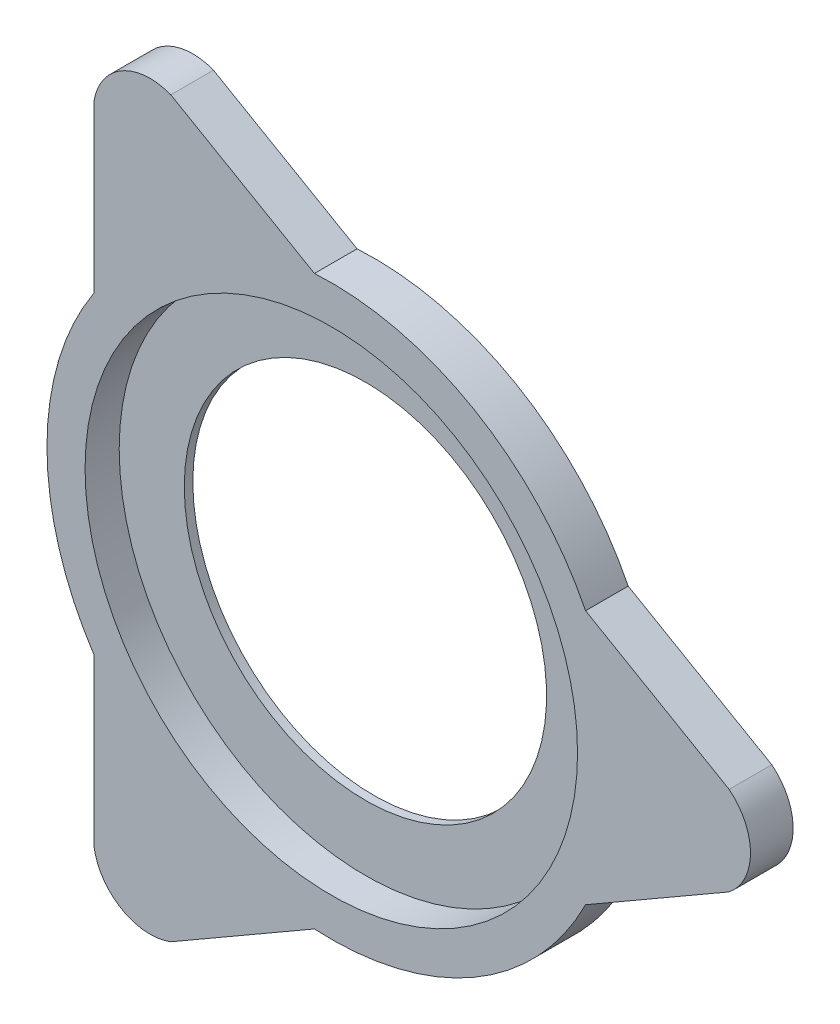
ISO-10303-21;
HEADER;
FILE_DESCRIPTION(('STEP AP214'),'2;1');
FILE_NAME('part.step','',(''),(''),'','','');
FILE_SCHEMA(('AUTOMOTIVE_DESIGN { 1 0 10303 214 1 1 1 1 }'));
ENDSEC;
DATA;
#1=APPLICATION_CONTEXT('core data for automotive mechanical design processes');
#2=APPLICATION_PROTOCOL_DEFINITION('international standard','automotive_design',2000,#1);
#3=PRODUCT_CONTEXT('',#1,'mechanical');
#4=PRODUCT('Part','Part','',(#3));
#5=PRODUCT_RELATED_PRODUCT_CATEGORY('part','',(#4));
#6=PRODUCT_DEFINITION_FORMATION('','',#4);
#7=PRODUCT_DEFINITION_CONTEXT('part definition',#1,'design');
#8=PRODUCT_DEFINITION('design','',#6,#7);
#9=PRODUCT_DEFINITION_SHAPE('','',#8);
#10=(LENGTH_UNIT() NAMED_UNIT(*) SI_UNIT(.MILLI.,.METRE.));
#11=(NAMED_UNIT(*) PLANE_ANGLE_UNIT() SI_UNIT($,.RADIAN.));
#12=(NAMED_UNIT(*) SI_UNIT($,.STERADIAN.) SOLID_ANGLE_UNIT());
#13=UNCERTAINTY_MEASURE_WITH_UNIT(LENGTH_MEASURE(1.E-05),#10,'distance_accuracy_value','');
#14=(GEOMETRIC_REPRESENTATION_CONTEXT(3) GLOBAL_UNCERTAINTY_ASSIGNED_CONTEXT((#13)) GLOBAL_UNIT_ASSIGNED_CONTEXT((#10,
#11,#12)) REPRESENTATION_CONTEXT('',''));
#15=CARTESIAN_POINT('',(0.,0.,0.));
#16=DIRECTION('',(0.,0.,1.));
#17=DIRECTION('',(1.,0.,0.));
#18=AXIS2_PLACEMENT_3D('',#15,#16,#17);
#19=CARTESIAN_POINT('',(0.,0.,9.525));
#20=DIRECTION('',(0.,0.,-1.));
#21=DIRECTION('',(-1.,0.,0.));
#22=AXIS2_PLACEMENT_3D('',#19,#20,#21);
#23=CYLINDRICAL_SURFACE('',#22,40.4563947467404);
#24=CARTESIAN_POINT('',(0.,0.,0.));
#25=DIRECTION('',(0.,0.,1.));
#26=DIRECTION('',(1.,0.,0.));
#27=AXIS2_PLACEMENT_3D('',#24,#25,#26);
#28=CIRCLE('',#27,40.4563947467404);
#29=CARTESIAN_POINT('',(-40.4563947467404,0.,0.));
#30=VERTEX_POINT('',#29);
#31=EDGE_CURVE('E163',#30,#30,#28,.T.);
#32=CARTESIAN_POINT('',(0.,0.,1.905));
#33=DIRECTION('',(0.,0.,1.));
#34=DIRECTION('',(1.,0.,0.));
#35=AXIS2_PLACEMENT_3D('',#32,#33,#34);
#36=CIRCLE('',#35,40.4563947467404);
#37=CARTESIAN_POINT('',(-40.4563947467404,0.,1.905));
#38=VERTEX_POINT('',#37);
#39=EDGE_CURVE('E41',#38,#38,#36,.T.);
#40=CARTESIAN_POINT('',(-40.4563947467404,0.,0.));
#41=CARTESIAN_POINT('',(-40.4563947467404,0.,0.0198437499999999));
#42=CARTESIAN_POINT('',(-40.4563947467404,0.,0.0396874999999998));
#43=CARTESIAN_POINT('',(-40.4563947467404,0.,0.0793749999999996));
#44=CARTESIAN_POINT('',(-40.4563947467404,0.,0.0992187499999995));
#45=CARTESIAN_POINT('',(-40.4563947467404,0.,0.13890625));
#46=CARTESIAN_POINT('',(-40.4563947467404,0.,0.15875));
#47=CARTESIAN_POINT('',(-40.4563947467404,0.,0.198437500000001));
#48=CARTESIAN_POINT('',(-40.4563947467404,0.,0.218281250000001));
#49=CARTESIAN_POINT('',(-40.4563947467404,0.,0.25796875));
#50=CARTESIAN_POINT('',(-40.4563947467404,0.,0.2778125));
#51=CARTESIAN_POINT('',(-40.4563947467404,0.,0.3175));
#52=CARTESIAN_POINT('',(-40.4563947467404,0.,0.33734375));
#53=CARTESIAN_POINT('',(-40.4563947467404,0.,0.37703125));
#54=CARTESIAN_POINT('',(-40.4563947467404,0.,0.396875000000001));
#55=CARTESIAN_POINT('',(-40.4563947467404,0.,0.436562500000001));
#56=CARTESIAN_POINT('',(-40.4563947467404,0.,0.456406250000001));
#57=CARTESIAN_POINT('',(-40.4563947467404,0.,0.496093750000001));
#58=CARTESIAN_POINT('',(-40.4563947467404,0.,0.515937500000001));
#59=CARTESIAN_POINT('',(-40.4563947467404,0.,0.555625000000001));
#60=CARTESIAN_POINT('',(-40.4563947467404,0.,0.57546875));
#61=CARTESIAN_POINT('',(-40.4563947467404,0.,0.61515625));
#62=CARTESIAN_POINT('',(-40.4563947467404,0.,0.635));
#63=CARTESIAN_POINT('',(-40.4563947467404,0.,0.6746875));
#64=CARTESIAN_POINT('',(-40.4563947467404,0.,0.694531250000001));
#65=CARTESIAN_POINT('',(-40.4563947467404,0.,0.734218750000001));
#66=CARTESIAN_POINT('',(-40.4563947467404,0.,0.754062500000001));
#67=CARTESIAN_POINT('',(-40.4563947467404,0.,0.793750000000001));
#68=CARTESIAN_POINT('',(-40.4563947467404,0.,0.813593750000001));
#69=CARTESIAN_POINT('',(-40.4563947467404,0.,0.853281250000001));
#70=CARTESIAN_POINT('',(-40.4563947467404,0.,0.873125000000001));
#71=CARTESIAN_POINT('',(-40.4563947467404,0.,0.912812500000001));
#72=CARTESIAN_POINT('',(-40.4563947467404,0.,0.932656250000002));
#73=CARTESIAN_POINT('',(-40.4563947467404,0.,0.972343750000002));
#74=CARTESIAN_POINT('',(-40.4563947467404,0.,0.992187500000002));
#75=CARTESIAN_POINT('',(-40.4563947467404,0.,1.031875));
#76=CARTESIAN_POINT('',(-40.4563947467404,0.,1.05171875));
#77=CARTESIAN_POINT('',(-40.4563947467404,0.,1.09140625));
#78=CARTESIAN_POINT('',(-40.4563947467404,0.,1.11125));
#79=CARTESIAN_POINT('',(-40.4563947467404,0.,1.1509375));
#80=CARTESIAN_POINT('',(-40.4563947467404,0.,1.17078125));
#81=CARTESIAN_POINT('',(-40.4563947467404,0.,1.21046875));
#82=CARTESIAN_POINT('',(-40.4563947467404,0.,1.2303125));
#83=CARTESIAN_POINT('',(-40.4563947467404,0.,1.27));
#84=CARTESIAN_POINT('',(-40.4563947467404,0.,1.28984375));
#85=CARTESIAN_POINT('',(-40.4563947467404,0.,1.32953125));
#86=CARTESIAN_POINT('',(-40.4563947467404,0.,1.349375));
#87=CARTESIAN_POINT('',(-40.4563947467404,0.,1.3890625));
#88=CARTESIAN_POINT('',(-40.4563947467404,0.,1.40890625));
#89=CARTESIAN_POINT('',(-40.4563947467404,0.,1.44859375));
#90=CARTESIAN_POINT('',(-40.4563947467404,0.,1.4684375));
#91=CARTESIAN_POINT('',(-40.4563947467404,0.,1.508125));
#92=CARTESIAN_POINT('',(-40.4563947467404,0.,1.52796875));
#93=CARTESIAN_POINT('',(-40.4563947467404,0.,1.56765625));
#94=CARTESIAN_POINT('',(-40.4563947467404,0.,1.5875));
#95=CARTESIAN_POINT('',(-40.4563947467404,0.,1.6271875));
#96=CARTESIAN_POINT('',(-40.4563947467404,0.,1.64703125));
#97=CARTESIAN_POINT('',(-40.4563947467404,0.,1.68671875));
#98=CARTESIAN_POINT('',(-40.4563947467404,0.,1.7065625));
#99=CARTESIAN_POINT('',(-40.4563947467404,0.,1.74625));
#100=CARTESIAN_POINT('',(-40.4563947467404,0.,1.76609375));
#101=CARTESIAN_POINT('',(-40.4563947467404,0.,1.80578125));
#102=CARTESIAN_POINT('',(-40.4563947467404,0.,1.825625));
#103=CARTESIAN_POINT('',(-40.4563947467404,0.,1.8653125));
#104=CARTESIAN_POINT('',(-40.4563947467404,0.,1.88515625));
#105=CARTESIAN_POINT('',(-40.4563947467404,0.,1.905));
#106=B_SPLINE_CURVE_WITH_KNOTS('',3,(#40,#41,#42,#43,#44,#45,#46,#47,#48,#49,#50,#51,#52,#53,
#54,#55,#56,#57,#58,#59,#60,#61,#62,#63,#64,#65,#66,#67,#68,#69,#70,#71,#72,#73,#74,#75,#76,#77,
#78,#79,#80,#81,#82,#83,#84,#85,#86,#87,#88,#89,#90,#91,#92,#93,#94,#95,#96,#97,#98,#99,#100,
#101,#102,#103,#104,#105),.UNSPECIFIED.,.F.,.F.,(4,2,2,2,2,2,2,2,2,2,2,2,2,2,2,2,2,2,2,2,2,2,2,
2,2,2,2,2,2,2,2,2,4),(0.,0.0595312499999997,0.119062499999999,0.178593750000001,0.238125,
0.29765625,0.3571875,0.416718750000001,0.476250000000001,0.535781250000001,0.5953125,0.65484375,
0.714375000000001,0.773906250000001,0.833437500000001,0.892968750000001,0.952500000000002,
1.01203125,1.0715625,1.13109375,1.190625,1.25015625,1.3096875,1.36921875,1.42875,1.48828125,
1.5478125,1.60734375,1.666875,1.72640625,1.7859375,1.84546875,1.905),.UNSPECIFIED.);
#107=EDGE_CURVE('BSEAM37',#30,#38,#106,.T.);
#108=ORIENTED_EDGE('',*,*,#31,.F.);
#109=ORIENTED_EDGE('',*,*,#39,.T.);
#110=ORIENTED_EDGE('',*,*,#107,.T.);
#111=ORIENTED_EDGE('',*,*,#107,.F.);
#112=EDGE_LOOP('',(#108,#110,#109,#111));
#113=FACE_BOUND('',#112,.T.);
#114=ADVANCED_FACE('F37',(#113),#23,.F.);
#115=CARTESIAN_POINT('',(0.,0.,9.525));
#116=DIRECTION('',(0.,0.,1.));
#117=DIRECTION('',(1.,0.,0.));
#118=AXIS2_PLACEMENT_3D('',#115,#116,#117);
#119=PLANE('',#118);
#120=CARTESIAN_POINT('',(0.,0.,9.525));
#121=DIRECTION('',(0.,0.,1.));
#122=DIRECTION('',(1.,0.,0.));
#123=AXIS2_PLACEMENT_3D('',#120,#121,#122);
#124=CIRCLE('',#123,54.9919447217432);
#125=CARTESIAN_POINT('',(54.9919447217432,0.,9.525));
#126=VERTEX_POINT('',#125);
#127=EDGE_CURVE('E359',#126,#126,#124,.T.);
#128=ORIENTED_EDGE('',*,*,#127,.F.);
#129=EDGE_LOOP('',(#128));
#130=FACE_BOUND('',#129,.T.);
#131=CARTESIAN_POINT('',(0.,0.,9.525));
#132=DIRECTION('',(0.,0.,1.));
#133=DIRECTION('',(1.,0.,0.));
#134=AXIS2_PLACEMENT_3D('',#131,#132,#133);
#135=CIRCLE('',#134,63.5);
#136=CARTESIAN_POINT('',(56.7796058709401,28.4310808296257,9.525));
#137=VERTEX_POINT('',#136);
#138=CARTESIAN_POINT('',(-3.76776467996547,63.388121515915,9.525));
#139=VERTEX_POINT('',#138);
#140=EDGE_CURVE('E182',#137,#139,#135,.T.);
#141=ORIENTED_EDGE('',*,*,#140,.T.);
#142=DIRECTION('',(-0.866025403784439,0.5,0.));
#143=VECTOR('',#142,1.);
#144=CARTESIAN_POINT('',(-3.76776467996547,63.388121515915,9.525));
#145=LINE('',#144,#143);
#146=CARTESIAN_POINT('',(-35.8333840191295,81.9012154731134,9.525));
#147=VERTEX_POINT('',#146);
#148=EDGE_CURVE('E110',#139,#147,#145,.T.);
#149=ORIENTED_EDGE('',*,*,#148,.T.);
#150=CARTESIAN_POINT('',(-40.4563947467404,70.072531192417,9.525));
#151=DIRECTION('',(0.,0.,1.));
#152=DIRECTION('',(-1.,0.,0.));
#153=AXIS2_PLACEMENT_3D('',#150,#151,#152);
#154=CIRCLE('',#153,12.7);
#155=CARTESIAN_POINT('',(-53.0118411909746,71.983228600686,9.525));
#156=VERTEX_POINT('',#155);
#157=EDGE_CURVE('E210',#147,#156,#154,.T.);
#158=ORIENTED_EDGE('',*,*,#157,.T.);
#159=DIRECTION('',(0.,-1.,0.));
#160=VECTOR('',#159,1.);
#161=CARTESIAN_POINT('',(-53.0118411909746,71.983228600686,9.525));
#162=LINE('',#161,#160);
#163=CARTESIAN_POINT('',(-53.0118411909746,34.9570406862893,9.525));
#164=VERTEX_POINT('',#163);
#165=EDGE_CURVE('E229',#156,#164,#162,.T.);
#166=ORIENTED_EDGE('',*,*,#165,.T.);
#167=CARTESIAN_POINT('',(0.,0.,9.525));
#168=DIRECTION('',(0.,0.,1.));
#169=DIRECTION('',(1.,0.,0.));
#170=AXIS2_PLACEMENT_3D('',#167,#168,#169);
#171=CIRCLE('',#170,63.5);
#172=CARTESIAN_POINT('',(-53.0118411909746,-34.9570406862893,9.525));
#173=VERTEX_POINT('',#172);
#174=EDGE_CURVE('E226',#164,#173,#171,.T.);
#175=ORIENTED_EDGE('',*,*,#174,.T.);
#176=DIRECTION('',(0.,-1.,0.));
#177=VECTOR('',#176,1.);
#178=CARTESIAN_POINT('',(-53.0118411909746,-34.9570406862893,9.525));
#179=LINE('',#178,#177);
#180=CARTESIAN_POINT('',(-53.0118411909746,-71.9832286006861,9.525));
#181=VERTEX_POINT('',#180);
#182=EDGE_CURVE('E228',#173,#181,#179,.T.);
#183=ORIENTED_EDGE('',*,*,#182,.T.);
#184=CARTESIAN_POINT('',(-40.4563947467404,-70.072531192417,9.525));
#185=DIRECTION('',(0.,0.,1.));
#186=DIRECTION('',(-1.,0.,0.));
#187=AXIS2_PLACEMENT_3D('',#184,#185,#186);
#188=CIRCLE('',#187,12.7);
#189=CARTESIAN_POINT('',(-35.8333840191293,-81.9012154731134,9.525));
#190=VERTEX_POINT('',#189);
#191=EDGE_CURVE('E231',#181,#190,#188,.T.);
#192=ORIENTED_EDGE('',*,*,#191,.T.);
#193=DIRECTION('',(0.866025403784438,0.500000000000001,0.));
#194=VECTOR('',#193,1.);
#195=CARTESIAN_POINT('',(-3.76776467996543,-63.388121515915,9.525));
#196=LINE('',#195,#194);
#197=CARTESIAN_POINT('',(-3.76776467996544,-63.388121515915,9.525));
#198=VERTEX_POINT('',#197);
#199=EDGE_CURVE('E237',#190,#198,#196,.T.);
#200=ORIENTED_EDGE('',*,*,#199,.T.);
#201=CARTESIAN_POINT('',(0.,0.,9.525));
#202=DIRECTION('',(0.,0.,1.));
#203=DIRECTION('',(1.,0.,0.));
#204=AXIS2_PLACEMENT_3D('',#201,#202,#203);
#205=CIRCLE('',#204,63.5);
#206=CARTESIAN_POINT('',(56.7796058709401,-28.4310808296256,9.525));
#207=VERTEX_POINT('',#206);
#208=EDGE_CURVE('E141',#198,#207,#205,.T.);
#209=ORIENTED_EDGE('',*,*,#208,.T.);
#210=DIRECTION('',(0.866025403784438,0.500000000000001,0.));
#211=VECTOR('',#210,1.);
#212=CARTESIAN_POINT('',(88.8452252101041,-9.9179868724272,9.525));
#213=LINE('',#212,#211);
#214=CARTESIAN_POINT('',(88.8452252101041,-9.91798687242719,9.525));
#215=VERTEX_POINT('',#214);
#216=EDGE_CURVE('E135',#207,#215,#213,.T.);
#217=ORIENTED_EDGE('',*,*,#216,.T.);
#218=CARTESIAN_POINT('',(80.9127894934808,0.,9.525));
#219=DIRECTION('',(0.,0.,1.));
#220=DIRECTION('',(-1.,0.,0.));
#221=AXIS2_PLACEMENT_3D('',#218,#219,#220);
#222=CIRCLE('',#221,12.7);
#223=CARTESIAN_POINT('',(88.845225210104,9.91798687242733,9.525));
#224=VERTEX_POINT('',#223);
#225=EDGE_CURVE('E139',#215,#224,#222,.T.);
#226=ORIENTED_EDGE('',*,*,#225,.T.);
#227=DIRECTION('',(-0.866025403784439,0.5,0.));
#228=VECTOR('',#227,1.);
#229=CARTESIAN_POINT('',(88.845225210104,9.91798687242733,9.525));
#230=LINE('',#229,#228);
#231=EDGE_CURVE('E55',#224,#137,#230,.T.);
#232=ORIENTED_EDGE('',*,*,#231,.T.);
#233=EDGE_LOOP('',(#141,#149,#158,#166,#175,#183,#192,#200,#209,#217,#226,#232));
#234=FACE_BOUND('',#233,.T.);
#235=ADVANCED_FACE('F137',(#130,#234),#119,.T.);
#236=CARTESIAN_POINT('',(0.,0.,0.));
#237=DIRECTION('',(0.,0.,1.));
#238=DIRECTION('',(1.,0.,0.));
#239=AXIS2_PLACEMENT_3D('',#236,#237,#238);
#240=PLANE('',#239);
#241=CARTESIAN_POINT('',(0.,0.,0.));
#242=DIRECTION('',(0.,0.,1.));
#243=DIRECTION('',(1.,0.,0.));
#244=AXIS2_PLACEMENT_3D('',#241,#242,#243);
#245=CIRCLE('',#244,63.5);
#246=CARTESIAN_POINT('',(56.7796058709401,28.4310808296257,0.));
#247=VERTEX_POINT('',#246);
#248=CARTESIAN_POINT('',(-3.76776467996547,63.388121515915,0.));
#249=VERTEX_POINT('',#248);
#250=EDGE_CURVE('E159',#247,#249,#245,.T.);
#251=ORIENTED_EDGE('',*,*,#250,.F.);
#252=DIRECTION('',(-0.866025403784439,0.5,0.));
#253=VECTOR('',#252,1.);
#254=CARTESIAN_POINT('',(88.845225210104,9.91798687242733,0.));
#255=LINE('',#254,#253);
#256=CARTESIAN_POINT('',(88.845225210104,9.91798687242733,0.));
#257=VERTEX_POINT('',#256);
#258=EDGE_CURVE('E102',#257,#247,#255,.T.);
#259=ORIENTED_EDGE('',*,*,#258,.F.);
#260=CARTESIAN_POINT('',(80.9127894934808,0.,0.));
#261=DIRECTION('',(0.,0.,1.));
#262=DIRECTION('',(-1.,0.,0.));
#263=AXIS2_PLACEMENT_3D('',#260,#261,#262);
#264=CIRCLE('',#263,12.7);
#265=CARTESIAN_POINT('',(88.8452252101041,-9.91798687242719,0.));
#266=VERTEX_POINT('',#265);
#267=EDGE_CURVE('E96',#266,#257,#264,.T.);
#268=ORIENTED_EDGE('',*,*,#267,.F.);
#269=DIRECTION('',(0.866025403784438,0.500000000000001,0.));
#270=VECTOR('',#269,1.);
#271=CARTESIAN_POINT('',(88.8452252101041,-9.9179868724272,0.));
#272=LINE('',#271,#270);
#273=CARTESIAN_POINT('',(56.7796058709401,-28.4310808296256,0.));
#274=VERTEX_POINT('',#273);
#275=EDGE_CURVE('E149',#274,#266,#272,.T.);
#276=ORIENTED_EDGE('',*,*,#275,.F.);
#277=CARTESIAN_POINT('',(0.,0.,0.));
#278=DIRECTION('',(0.,0.,1.));
#279=DIRECTION('',(1.,0.,0.));
#280=AXIS2_PLACEMENT_3D('',#277,#278,#279);
#281=CIRCLE('',#280,63.5);
#282=CARTESIAN_POINT('',(-3.76776467996544,-63.388121515915,0.));
#283=VERTEX_POINT('',#282);
#284=EDGE_CURVE('E177',#283,#274,#281,.T.);
#285=ORIENTED_EDGE('',*,*,#284,.F.);
#286=DIRECTION('',(0.866025403784438,0.500000000000001,0.));
#287=VECTOR('',#286,1.);
#288=CARTESIAN_POINT('',(-3.76776467996543,-63.388121515915,0.));
#289=LINE('',#288,#287);
#290=CARTESIAN_POINT('',(-35.8333840191293,-81.9012154731134,0.));
#291=VERTEX_POINT('',#290);
#292=EDGE_CURVE('E175',#291,#283,#289,.T.);
#293=ORIENTED_EDGE('',*,*,#292,.F.);
#294=CARTESIAN_POINT('',(-40.4563947467404,-70.072531192417,0.));
#295=DIRECTION('',(0.,0.,1.));
#296=DIRECTION('',(-1.,0.,0.));
#297=AXIS2_PLACEMENT_3D('',#294,#295,#296);
#298=CIRCLE('',#297,12.7);
#299=CARTESIAN_POINT('',(-53.0118411909746,-71.9832286006861,0.));
#300=VERTEX_POINT('',#299);
#301=EDGE_CURVE('E173',#300,#291,#298,.T.);
#302=ORIENTED_EDGE('',*,*,#301,.F.);
#303=DIRECTION('',(0.,-1.,0.));
#304=VECTOR('',#303,1.);
#305=CARTESIAN_POINT('',(-53.0118411909746,-34.9570406862893,0.));
#306=LINE('',#305,#304);
#307=CARTESIAN_POINT('',(-53.0118411909746,-34.9570406862893,0.));
#308=VERTEX_POINT('',#307);
#309=EDGE_CURVE('E171',#308,#300,#306,.T.);
#310=ORIENTED_EDGE('',*,*,#309,.F.);
#311=CARTESIAN_POINT('',(0.,0.,0.));
#312=DIRECTION('',(0.,0.,1.));
#313=DIRECTION('',(1.,0.,0.));
#314=AXIS2_PLACEMENT_3D('',#311,#312,#313);
#315=CIRCLE('',#314,63.5);
#316=CARTESIAN_POINT('',(-53.0118411909746,34.9570406862893,0.));
#317=VERTEX_POINT('',#316);
#318=EDGE_CURVE('E169',#317,#308,#315,.T.);
#319=ORIENTED_EDGE('',*,*,#318,.F.);
#320=DIRECTION('',(0.,-1.,0.));
#321=VECTOR('',#320,1.);
#322=CARTESIAN_POINT('',(-53.0118411909746,71.983228600686,0.));
#323=LINE('',#322,#321);
#324=CARTESIAN_POINT('',(-53.0118411909746,71.983228600686,0.));
#325=VERTEX_POINT('',#324);
#326=EDGE_CURVE('E167',#325,#317,#323,.T.);
#327=ORIENTED_EDGE('',*,*,#326,.F.);
#328=CARTESIAN_POINT('',(-40.4563947467404,70.072531192417,0.));
#329=DIRECTION('',(0.,0.,1.));
#330=DIRECTION('',(-1.,0.,0.));
#331=AXIS2_PLACEMENT_3D('',#328,#329,#330);
#332=CIRCLE('',#331,12.7);
#333=CARTESIAN_POINT('',(-35.8333840191295,81.9012154731134,0.));
#334=VERTEX_POINT('',#333);
#335=EDGE_CURVE('E165',#334,#325,#332,.T.);
#336=ORIENTED_EDGE('',*,*,#335,.F.);
#337=DIRECTION('',(-0.866025403784439,0.5,0.));
#338=VECTOR('',#337,1.);
#339=CARTESIAN_POINT('',(-3.76776467996547,63.388121515915,0.));
#340=LINE('',#339,#338);
#341=EDGE_CURVE('E162',#249,#334,#340,.T.);
#342=ORIENTED_EDGE('',*,*,#341,.F.);
#343=EDGE_LOOP('',(#251,#259,#268,#276,#285,#293,#302,#310,#319,#327,#336,#342));
#344=FACE_BOUND('',#343,.T.);
#345=ORIENTED_EDGE('',*,*,#31,.T.);
#346=EDGE_LOOP('',(#345));
#347=FACE_BOUND('',#346,.T.);
#348=ADVANCED_FACE('F214',(#344,#347),#240,.F.);
#349=CARTESIAN_POINT('',(0.,0.,9.525));
#350=DIRECTION('',(0.,0.,-1.));
#351=DIRECTION('',(-1.,0.,0.));
#352=AXIS2_PLACEMENT_3D('',#349,#350,#351);
#353=CYLINDRICAL_SURFACE('',#352,63.5);
#354=ORIENTED_EDGE('',*,*,#250,.T.);
#355=DIRECTION('',(0.,0.,-1.));
#356=VECTOR('',#355,1.);
#357=CARTESIAN_POINT('',(-3.76776467996547,63.388121515915,9.525));
#358=LINE('',#357,#356);
#359=EDGE_CURVE('E11',#139,#249,#358,.T.);
#360=ORIENTED_EDGE('',*,*,#359,.F.);
#361=ORIENTED_EDGE('',*,*,#140,.F.);
#362=DIRECTION('',(0.,0.,-1.));
#363=VECTOR('',#362,1.);
#364=CARTESIAN_POINT('',(56.7796058709401,28.4310808296257,9.525));
#365=LINE('',#364,#363);
#366=EDGE_CURVE('E155',#137,#247,#365,.T.);
#367=ORIENTED_EDGE('',*,*,#366,.T.);
#368=EDGE_LOOP('',(#354,#360,#361,#367));
#369=FACE_BOUND('',#368,.T.);
#370=ADVANCED_FACE('F39',(#369),#353,.T.);
#371=CARTESIAN_POINT('',(-3.76776467996547,63.388121515915,9.525));
#372=DIRECTION('',(-0.5,-0.866025403784439,0.));
#373=DIRECTION('',(0.866025403784439,-0.5,0.));
#374=AXIS2_PLACEMENT_3D('',#371,#372,#373);
#375=PLANE('',#374);
#376=ORIENTED_EDGE('',*,*,#341,.T.);
#377=DIRECTION('',(0.,0.,-1.));
#378=VECTOR('',#377,1.);
#379=CARTESIAN_POINT('',(-35.8333840191295,81.9012154731134,9.525));
#380=LINE('',#379,#378);
#381=EDGE_CURVE('E47',#147,#334,#380,.T.);
#382=ORIENTED_EDGE('',*,*,#381,.F.);
#383=ORIENTED_EDGE('',*,*,#148,.F.);
#384=ORIENTED_EDGE('',*,*,#359,.T.);
#385=EDGE_LOOP('',(#376,#382,#383,#384));
#386=FACE_BOUND('',#385,.T.);
#387=ADVANCED_FACE('F279',(#386),#375,.F.);
#388=CARTESIAN_POINT('',(-40.4563947467404,70.072531192417,9.525));
#389=DIRECTION('',(0.,0.,-1.));
#390=DIRECTION('',(-1.,0.,0.));
#391=AXIS2_PLACEMENT_3D('',#388,#389,#390);
#392=CYLINDRICAL_SURFACE('',#391,12.7);
#393=ORIENTED_EDGE('',*,*,#335,.T.);
#394=DIRECTION('',(0.,0.,-1.));
#395=VECTOR('',#394,1.);
#396=CARTESIAN_POINT('',(-53.0118411909746,71.983228600686,9.525));
#397=LINE('',#396,#395);
#398=EDGE_CURVE('E201',#156,#325,#397,.T.);
#399=ORIENTED_EDGE('',*,*,#398,.F.);
#400=ORIENTED_EDGE('',*,*,#157,.F.);
#401=ORIENTED_EDGE('',*,*,#381,.T.);
#402=EDGE_LOOP('',(#393,#399,#400,#401));
#403=FACE_BOUND('',#402,.T.);
#404=ADVANCED_FACE('F208',(#403),#392,.T.);
#405=CARTESIAN_POINT('',(-53.0118411909746,71.983228600686,9.525));
#406=DIRECTION('',(1.,0.,0.));
#407=DIRECTION('',(0.,1.,0.));
#408=AXIS2_PLACEMENT_3D('',#405,#406,#407);
#409=PLANE('',#408);
#410=ORIENTED_EDGE('',*,*,#326,.T.);
#411=DIRECTION('',(0.,0.,-1.));
#412=VECTOR('',#411,1.);
#413=CARTESIAN_POINT('',(-53.0118411909746,34.9570406862893,9.525));
#414=LINE('',#413,#412);
#415=EDGE_CURVE('E198',#164,#317,#414,.T.);
#416=ORIENTED_EDGE('',*,*,#415,.F.);
#417=ORIENTED_EDGE('',*,*,#165,.F.);
#418=ORIENTED_EDGE('',*,*,#398,.T.);
#419=EDGE_LOOP('',(#410,#416,#417,#418));
#420=FACE_BOUND('',#419,.T.);
#421=ADVANCED_FACE('F220',(#420),#409,.F.);
#422=CARTESIAN_POINT('',(0.,0.,9.525));
#423=DIRECTION('',(0.,0.,-1.));
#424=DIRECTION('',(-1.,0.,0.));
#425=AXIS2_PLACEMENT_3D('',#422,#423,#424);
#426=CYLINDRICAL_SURFACE('',#425,63.5);
#427=ORIENTED_EDGE('',*,*,#318,.T.);
#428=DIRECTION('',(0.,0.,-1.));
#429=VECTOR('',#428,1.);
#430=CARTESIAN_POINT('',(-53.0118411909746,-34.9570406862893,9.525));
#431=LINE('',#430,#429);
#432=EDGE_CURVE('E195',#173,#308,#431,.T.);
#433=ORIENTED_EDGE('',*,*,#432,.F.);
#434=ORIENTED_EDGE('',*,*,#174,.F.);
#435=ORIENTED_EDGE('',*,*,#415,.T.);
#436=EDGE_LOOP('',(#427,#433,#434,#435));
#437=FACE_BOUND('',#436,.T.);
#438=ADVANCED_FACE('F224',(#437),#426,.T.);
#439=CARTESIAN_POINT('',(-53.0118411909746,-34.9570406862893,9.525));
#440=DIRECTION('',(1.,0.,0.));
#441=DIRECTION('',(0.,1.,0.));
#442=AXIS2_PLACEMENT_3D('',#439,#440,#441);
#443=PLANE('',#442);
#444=ORIENTED_EDGE('',*,*,#309,.T.);
#445=DIRECTION('',(0.,0.,-1.));
#446=VECTOR('',#445,1.);
#447=CARTESIAN_POINT('',(-53.0118411909746,-71.9832286006861,9.525));
#448=LINE('',#447,#446);
#449=EDGE_CURVE('E192',#181,#300,#448,.T.);
#450=ORIENTED_EDGE('',*,*,#449,.F.);
#451=ORIENTED_EDGE('',*,*,#182,.F.);
#452=ORIENTED_EDGE('',*,*,#432,.T.);
#453=EDGE_LOOP('',(#444,#450,#451,#452));
#454=FACE_BOUND('',#453,.T.);
#455=ADVANCED_FACE('F292',(#454),#443,.F.);
#456=CARTESIAN_POINT('',(-40.4563947467404,-70.072531192417,9.525));
#457=DIRECTION('',(0.,0.,-1.));
#458=DIRECTION('',(-1.,0.,0.));
#459=AXIS2_PLACEMENT_3D('',#456,#457,#458);
#460=CYLINDRICAL_SURFACE('',#459,12.7);
#461=ORIENTED_EDGE('',*,*,#301,.T.);
#462=DIRECTION('',(0.,0.,-1.));
#463=VECTOR('',#462,1.);
#464=CARTESIAN_POINT('',(-35.8333840191293,-81.9012154731134,9.525));
#465=LINE('',#464,#463);
#466=EDGE_CURVE('E189',#190,#291,#465,.T.);
#467=ORIENTED_EDGE('',*,*,#466,.F.);
#468=ORIENTED_EDGE('',*,*,#191,.F.);
#469=ORIENTED_EDGE('',*,*,#449,.T.);
#470=EDGE_LOOP('',(#461,#467,#468,#469));
#471=FACE_BOUND('',#470,.T.);
#472=ADVANCED_FACE('F295',(#471),#460,.T.);
#473=CARTESIAN_POINT('',(-3.76776467996543,-63.388121515915,9.525));
#474=DIRECTION('',(-0.500000000000001,0.866025403784438,0.));
#475=DIRECTION('',(-0.866025403784438,-0.500000000000001,0.));
#476=AXIS2_PLACEMENT_3D('',#473,#474,#475);
#477=PLANE('',#476);
#478=ORIENTED_EDGE('',*,*,#292,.T.);
#479=DIRECTION('',(0.,0.,-1.));
#480=VECTOR('',#479,1.);
#481=CARTESIAN_POINT('',(-3.76776467996544,-63.388121515915,9.525));
#482=LINE('',#481,#480);
#483=EDGE_CURVE('E186',#198,#283,#482,.T.);
#484=ORIENTED_EDGE('',*,*,#483,.F.);
#485=ORIENTED_EDGE('',*,*,#199,.F.);
#486=ORIENTED_EDGE('',*,*,#466,.T.);
#487=EDGE_LOOP('',(#478,#484,#485,#486));
#488=FACE_BOUND('',#487,.T.);
#489=ADVANCED_FACE('F243',(#488),#477,.F.);
#490=CARTESIAN_POINT('',(0.,0.,9.525));
#491=DIRECTION('',(0.,0.,-1.));
#492=DIRECTION('',(-1.,0.,0.));
#493=AXIS2_PLACEMENT_3D('',#490,#491,#492);
#494=CYLINDRICAL_SURFACE('',#493,63.5);
#495=ORIENTED_EDGE('',*,*,#284,.T.);
#496=DIRECTION('',(0.,0.,-1.));
#497=VECTOR('',#496,1.);
#498=CARTESIAN_POINT('',(56.7796058709401,-28.4310808296256,9.525));
#499=LINE('',#498,#497);
#500=EDGE_CURVE('E150',#207,#274,#499,.T.);
#501=ORIENTED_EDGE('',*,*,#500,.F.);
#502=ORIENTED_EDGE('',*,*,#208,.F.);
#503=ORIENTED_EDGE('',*,*,#483,.T.);
#504=EDGE_LOOP('',(#495,#501,#502,#503));
#505=FACE_BOUND('',#504,.T.);
#506=ADVANCED_FACE('F247',(#505),#494,.T.);
#507=CARTESIAN_POINT('',(88.8452252101041,-9.9179868724272,9.525));
#508=DIRECTION('',(-0.500000000000001,0.866025403784438,0.));
#509=DIRECTION('',(-0.866025403784438,-0.500000000000001,0.));
#510=AXIS2_PLACEMENT_3D('',#507,#508,#509);
#511=PLANE('',#510);
#512=ORIENTED_EDGE('',*,*,#275,.T.);
#513=DIRECTION('',(0.,0.,-1.));
#514=VECTOR('',#513,1.);
#515=CARTESIAN_POINT('',(88.8452252101041,-9.91798687242719,9.525));
#516=LINE('',#515,#514);
#517=EDGE_CURVE('E146',#215,#266,#516,.T.);
#518=ORIENTED_EDGE('',*,*,#517,.F.);
#519=ORIENTED_EDGE('',*,*,#216,.F.);
#520=ORIENTED_EDGE('',*,*,#500,.T.);
#521=EDGE_LOOP('',(#512,#518,#519,#520));
#522=FACE_BOUND('',#521,.T.);
#523=ADVANCED_FACE('F147',(#522),#511,.F.);
#524=CARTESIAN_POINT('',(80.9127894934808,0.,9.525));
#525=DIRECTION('',(0.,0.,-1.));
#526=DIRECTION('',(-1.,0.,0.));
#527=AXIS2_PLACEMENT_3D('',#524,#525,#526);
#528=CYLINDRICAL_SURFACE('',#527,12.7);
#529=ORIENTED_EDGE('',*,*,#267,.T.);
#530=DIRECTION('',(0.,0.,-1.));
#531=VECTOR('',#530,1.);
#532=CARTESIAN_POINT('',(88.845225210104,9.91798687242733,9.525));
#533=LINE('',#532,#531);
#534=EDGE_CURVE('E151',#224,#257,#533,.T.);
#535=ORIENTED_EDGE('',*,*,#534,.F.);
#536=ORIENTED_EDGE('',*,*,#225,.F.);
#537=ORIENTED_EDGE('',*,*,#517,.T.);
#538=EDGE_LOOP('',(#529,#535,#536,#537));
#539=FACE_BOUND('',#538,.T.);
#540=ADVANCED_FACE('F153',(#539),#528,.T.);
#541=CARTESIAN_POINT('',(88.845225210104,9.91798687242733,9.525));
#542=DIRECTION('',(-0.5,-0.866025403784439,0.));
#543=DIRECTION('',(0.866025403784439,-0.5,0.));
#544=AXIS2_PLACEMENT_3D('',#541,#542,#543);
#545=PLANE('',#544);
#546=ORIENTED_EDGE('',*,*,#258,.T.);
#547=ORIENTED_EDGE('',*,*,#366,.F.);
#548=ORIENTED_EDGE('',*,*,#231,.F.);
#549=ORIENTED_EDGE('',*,*,#534,.T.);
#550=EDGE_LOOP('',(#546,#547,#548,#549));
#551=FACE_BOUND('',#550,.T.);
#552=ADVANCED_FACE('F251',(#551),#545,.F.);
#553=CARTESIAN_POINT('',(0.,0.,1.905));
#554=DIRECTION('',(0.,0.,1.));
#555=DIRECTION('',(1.,0.,0.));
#556=AXIS2_PLACEMENT_3D('',#553,#554,#555);
#557=CYLINDRICAL_SURFACE('',#556,54.9919447217432);
#558=CARTESIAN_POINT('',(0.,0.,1.905));
#559=DIRECTION('',(0.,0.,1.));
#560=DIRECTION('',(1.,0.,0.));
#561=AXIS2_PLACEMENT_3D('',#558,#559,#560);
#562=CIRCLE('',#561,54.9919447217432);
#563=CARTESIAN_POINT('',(54.9919447217432,0.,1.905));
#564=VERTEX_POINT('',#563);
#565=EDGE_CURVE('E358',#564,#564,#562,.T.);
#566=CARTESIAN_POINT('',(54.9919447217432,0.,1.905));
#567=CARTESIAN_POINT('',(54.9919447217432,0.,1.984375));
#568=CARTESIAN_POINT('',(54.9919447217432,0.,2.06375));
#569=CARTESIAN_POINT('',(54.9919447217432,0.,2.2225));
#570=CARTESIAN_POINT('',(54.9919447217432,0.,2.301875));
#571=CARTESIAN_POINT('',(54.9919447217432,0.,2.460625));
#572=CARTESIAN_POINT('',(54.9919447217432,0.,2.54));
#573=CARTESIAN_POINT('',(54.9919447217432,0.,2.69875));
#574=CARTESIAN_POINT('',(54.9919447217432,0.,2.778125));
#575=CARTESIAN_POINT('',(54.9919447217432,0.,2.936875));
#576=CARTESIAN_POINT('',(54.9919447217432,0.,3.01625));
#577=CARTESIAN_POINT('',(54.9919447217432,0.,3.175));
#578=CARTESIAN_POINT('',(54.9919447217432,0.,3.254375));
#579=CARTESIAN_POINT('',(54.9919447217432,0.,3.413125));
#580=CARTESIAN_POINT('',(54.9919447217432,0.,3.4925));
#581=CARTESIAN_POINT('',(54.9919447217432,0.,3.65125));
#582=CARTESIAN_POINT('',(54.9919447217432,0.,3.730625));
#583=CARTESIAN_POINT('',(54.9919447217432,0.,3.889375));
#584=CARTESIAN_POINT('',(54.9919447217432,0.,3.96875));
#585=CARTESIAN_POINT('',(54.9919447217432,0.,4.1275));
#586=CARTESIAN_POINT('',(54.9919447217432,0.,4.206875));
#587=CARTESIAN_POINT('',(54.9919447217432,0.,4.365625));
#588=CARTESIAN_POINT('',(54.9919447217432,0.,4.445));
#589=CARTESIAN_POINT('',(54.9919447217432,0.,4.60375));
#590=CARTESIAN_POINT('',(54.9919447217432,0.,4.683125));
#591=CARTESIAN_POINT('',(54.9919447217432,0.,4.841875));
#592=CARTESIAN_POINT('',(54.9919447217432,0.,4.92125));
#593=CARTESIAN_POINT('',(54.9919447217432,0.,5.08));
#594=CARTESIAN_POINT('',(54.9919447217432,0.,5.159375));
#595=CARTESIAN_POINT('',(54.9919447217432,0.,5.318125));
#596=CARTESIAN_POINT('',(54.9919447217432,0.,5.3975));
#597=CARTESIAN_POINT('',(54.9919447217432,0.,5.55625));
#598=CARTESIAN_POINT('',(54.9919447217432,0.,5.635625));
#599=CARTESIAN_POINT('',(54.9919447217432,0.,5.794375));
#600=CARTESIAN_POINT('',(54.9919447217432,0.,5.87375));
#601=CARTESIAN_POINT('',(54.9919447217432,0.,6.0325));
#602=CARTESIAN_POINT('',(54.9919447217432,0.,6.111875));
#603=CARTESIAN_POINT('',(54.9919447217432,0.,6.270625));
#604=CARTESIAN_POINT('',(54.9919447217432,0.,6.35));
#605=CARTESIAN_POINT('',(54.9919447217432,0.,6.50875));
#606=CARTESIAN_POINT('',(54.9919447217432,0.,6.588125));
#607=CARTESIAN_POINT('',(54.9919447217432,0.,6.746875));
#608=CARTESIAN_POINT('',(54.9919447217432,0.,6.82625));
#609=CARTESIAN_POINT('',(54.9919447217432,0.,6.985));
#610=CARTESIAN_POINT('',(54.9919447217432,0.,7.064375));
#611=CARTESIAN_POINT('',(54.9919447217432,0.,7.223125));
#612=CARTESIAN_POINT('',(54.9919447217432,0.,7.3025));
#613=CARTESIAN_POINT('',(54.9919447217432,0.,7.46125));
#614=CARTESIAN_POINT('',(54.9919447217432,0.,7.540625));
#615=CARTESIAN_POINT('',(54.9919447217432,0.,7.699375));
#616=CARTESIAN_POINT('',(54.9919447217432,0.,7.77875));
#617=CARTESIAN_POINT('',(54.9919447217432,0.,7.9375));
#618=CARTESIAN_POINT('',(54.9919447217432,0.,8.016875));
#619=CARTESIAN_POINT('',(54.9919447217432,0.,8.175625));
#620=CARTESIAN_POINT('',(54.9919447217432,0.,8.255));
#621=CARTESIAN_POINT('',(54.9919447217432,0.,8.41375));
#622=CARTESIAN_POINT('',(54.9919447217432,0.,8.493125));
#623=CARTESIAN_POINT('',(54.9919447217432,0.,8.651875));
#624=CARTESIAN_POINT('',(54.9919447217432,0.,8.73125));
#625=CARTESIAN_POINT('',(54.9919447217432,0.,8.89));
#626=CARTESIAN_POINT('',(54.9919447217432,0.,8.969375));
#627=CARTESIAN_POINT('',(54.9919447217432,0.,9.128125));
#628=CARTESIAN_POINT('',(54.9919447217432,0.,9.2075));
#629=CARTESIAN_POINT('',(54.9919447217432,0.,9.36625));
#630=CARTESIAN_POINT('',(54.9919447217432,0.,9.445625));
#631=CARTESIAN_POINT('',(54.9919447217432,0.,9.525));
#632=B_SPLINE_CURVE_WITH_KNOTS('',3,(#566,#567,#568,#569,#570,#571,#572,#573,#574,#575,#576,
#577,#578,#579,#580,#581,#582,#583,#584,#585,#586,#587,#588,#589,#590,#591,#592,#593,#594,#595,
#596,#597,#598,#599,#600,#601,#602,#603,#604,#605,#606,#607,#608,#609,#610,#611,#612,#613,#614,
#615,#616,#617,#618,#619,#620,#621,#622,#623,#624,#625,#626,#627,#628,#629,#630,#631),
.UNSPECIFIED.,.F.,.F.,(4,2,2,2,2,2,2,2,2,2,2,2,2,2,2,2,2,2,2,2,2,2,2,2,2,2,2,2,2,2,2,2,4),(0.,
0.238125,0.47625,0.714375,0.9525,1.190625,1.42875,1.666875,1.905,2.143125,2.38125,2.619375,
2.8575,3.095625,3.33375,3.571875,3.81,4.048125,4.28625,4.524375,4.7625,5.000625,5.23875,
5.476875,5.715,5.953125,6.19125,6.429375,6.6675,6.905625,7.14375,7.381875,7.62),.UNSPECIFIED.);
#633=EDGE_CURVE('BSEAM253',#564,#126,#632,.T.);
#634=ORIENTED_EDGE('',*,*,#565,.F.);
#635=ORIENTED_EDGE('',*,*,#127,.T.);
#636=ORIENTED_EDGE('',*,*,#633,.T.);
#637=ORIENTED_EDGE('',*,*,#633,.F.);
#638=EDGE_LOOP('',(#634,#636,#635,#637));
#639=FACE_BOUND('',#638,.T.);
#640=ADVANCED_FACE('F253',(#639),#557,.F.);
#641=CARTESIAN_POINT('',(0.,0.,1.905));
#642=DIRECTION('',(0.,0.,1.));
#643=DIRECTION('',(1.,0.,0.));
#644=AXIS2_PLACEMENT_3D('',#641,#642,#643);
#645=PLANE('',#644);
#646=ORIENTED_EDGE('',*,*,#39,.F.);
#647=EDGE_LOOP('',(#646));
#648=FACE_BOUND('',#647,.T.);
#649=ORIENTED_EDGE('',*,*,#565,.T.);
#650=EDGE_LOOP('',(#649));
#651=FACE_BOUND('',#650,.T.);
#652=ADVANCED_FACE('F259',(#648,#651),#645,.T.);
#653=CLOSED_SHELL('',(#114,#235,#348,#370,#387,#404,#421,#438,#455,#472,#489,#506,#523,#540,
#552,#640,#652));
#654=MANIFOLD_SOLID_BREP('B2',#653);
#655=ADVANCED_BREP_SHAPE_REPRESENTATION('',(#18,#654),#14);
#656=SHAPE_DEFINITION_REPRESENTATION(#9,#655);
ENDSEC;
END-ISO-10303-21;
